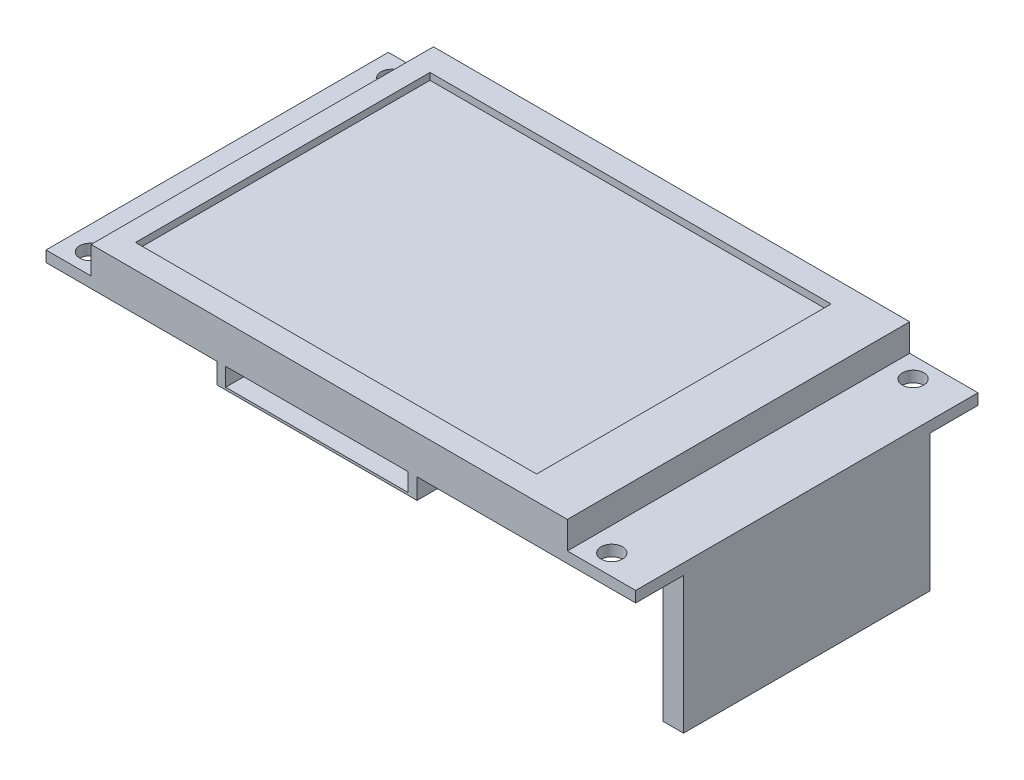
ISO-10303-21;
HEADER;
FILE_DESCRIPTION(('STEP AP214'),'2;1');
FILE_NAME('part.step','',(''),(''),'','','');
FILE_SCHEMA(('AUTOMOTIVE_DESIGN { 1 0 10303 214 1 1 1 1 }'));
ENDSEC;
DATA;
#1=APPLICATION_CONTEXT('core data for automotive mechanical design processes');
#2=APPLICATION_PROTOCOL_DEFINITION('international standard','automotive_design',2000,#1);
#3=PRODUCT_CONTEXT('',#1,'mechanical');
#4=PRODUCT('Part','Part','',(#3));
#5=PRODUCT_RELATED_PRODUCT_CATEGORY('part','',(#4));
#6=PRODUCT_DEFINITION_FORMATION('','',#4);
#7=PRODUCT_DEFINITION_CONTEXT('part definition',#1,'design');
#8=PRODUCT_DEFINITION('design','',#6,#7);
#9=PRODUCT_DEFINITION_SHAPE('','',#8);
#10=(LENGTH_UNIT() NAMED_UNIT(*) SI_UNIT(.MILLI.,.METRE.));
#11=(NAMED_UNIT(*) PLANE_ANGLE_UNIT() SI_UNIT($,.RADIAN.));
#12=(NAMED_UNIT(*) SI_UNIT($,.STERADIAN.) SOLID_ANGLE_UNIT());
#13=UNCERTAINTY_MEASURE_WITH_UNIT(LENGTH_MEASURE(1.E-05),#10,'distance_accuracy_value','');
#14=(GEOMETRIC_REPRESENTATION_CONTEXT(3) GLOBAL_UNCERTAINTY_ASSIGNED_CONTEXT((#13)) GLOBAL_UNIT_ASSIGNED_CONTEXT((#10,
#11,#12)) REPRESENTATION_CONTEXT('',''));
#15=CARTESIAN_POINT('',(0.,0.,0.));
#16=DIRECTION('',(0.,0.,1.));
#17=DIRECTION('',(1.,0.,0.));
#18=AXIS2_PLACEMENT_3D('',#15,#16,#17);
#19=CARTESIAN_POINT('',(0.,0.,0.));
#20=DIRECTION('',(0.,-1.,0.));
#21=DIRECTION('',(0.,0.,-1.));
#22=AXIS2_PLACEMENT_3D('',#19,#20,#21);
#23=PLANE('',#22);
#24=CARTESIAN_POINT('',(-39.65,0.,22.05));
#25=DIRECTION('',(0.,1.,0.));
#26=DIRECTION('',(0.,0.,1.));
#27=AXIS2_PLACEMENT_3D('',#24,#25,#26);
#28=CIRCLE('',#27,1.57);
#29=CARTESIAN_POINT('',(-39.65,0.,23.62));
#30=VERTEX_POINT('',#29);
#31=EDGE_CURVE('E346',#30,#30,#28,.T.);
#32=ORIENTED_EDGE('',*,*,#31,.T.);
#33=EDGE_LOOP('',(#32));
#34=FACE_BOUND('',#33,.T.);
#35=CARTESIAN_POINT('',(36.65,0.,-22.05));
#36=DIRECTION('',(0.,1.,0.));
#37=DIRECTION('',(0.,0.,1.));
#38=AXIS2_PLACEMENT_3D('',#35,#36,#37);
#39=CIRCLE('',#38,1.56999999999999);
#40=CARTESIAN_POINT('',(36.65,0.,-20.48));
#41=VERTEX_POINT('',#40);
#42=EDGE_CURVE('E353',#41,#41,#39,.T.);
#43=ORIENTED_EDGE('',*,*,#42,.T.);
#44=EDGE_LOOP('',(#43));
#45=FACE_BOUND('',#44,.T.);
#46=CARTESIAN_POINT('',(36.65,0.,22.05));
#47=DIRECTION('',(0.,1.,0.));
#48=DIRECTION('',(0.,0.,1.));
#49=AXIS2_PLACEMENT_3D('',#46,#47,#48);
#50=CIRCLE('',#49,1.56999999999999);
#51=CARTESIAN_POINT('',(36.65,0.,23.62));
#52=VERTEX_POINT('',#51);
#53=EDGE_CURVE('E359',#52,#52,#50,.T.);
#54=ORIENTED_EDGE('',*,*,#53,.T.);
#55=EDGE_LOOP('',(#54));
#56=FACE_BOUND('',#55,.T.);
#57=CARTESIAN_POINT('',(-39.65,0.,-22.05));
#58=DIRECTION('',(0.,1.,0.));
#59=DIRECTION('',(0.,0.,1.));
#60=AXIS2_PLACEMENT_3D('',#57,#58,#59);
#61=CIRCLE('',#60,1.57);
#62=CARTESIAN_POINT('',(-39.65,0.,-20.48));
#63=VERTEX_POINT('',#62);
#64=EDGE_CURVE('E364',#63,#63,#61,.T.);
#65=ORIENTED_EDGE('',*,*,#64,.T.);
#66=EDGE_LOOP('',(#65));
#67=FACE_BOUND('',#66,.T.);
#68=DIRECTION('',(1.,0.,0.));
#69=VECTOR('',#68,1.);
#70=CARTESIAN_POINT('',(-18.15,0.,5.04999999999999));
#71=LINE('',#70,#69);
#72=CARTESIAN_POINT('',(-18.15,0.,5.04999999999999));
#73=VERTEX_POINT('',#72);
#74=CARTESIAN_POINT('',(11.15,0.,5.04999999999999));
#75=VERTEX_POINT('',#74);
#76=EDGE_CURVE('E276',#73,#75,#71,.T.);
#77=ORIENTED_EDGE('',*,*,#76,.F.);
#78=DIRECTION('',(0.,0.,-1.));
#79=VECTOR('',#78,1.);
#80=CARTESIAN_POINT('',(-18.15,0.,25.05));
#81=LINE('',#80,#79);
#82=CARTESIAN_POINT('',(-18.15,0.,25.05));
#83=VERTEX_POINT('',#82);
#84=EDGE_CURVE('E257',#83,#73,#81,.T.);
#85=ORIENTED_EDGE('',*,*,#84,.F.);
#86=DIRECTION('',(1.,0.,0.));
#87=VECTOR('',#86,1.);
#88=CARTESIAN_POINT('',(-43.15,0.,25.05));
#89=LINE('',#88,#87);
#90=CARTESIAN_POINT('',(-43.15,0.,25.05));
#91=VERTEX_POINT('',#90);
#92=EDGE_CURVE('E374',#91,#83,#89,.T.);
#93=ORIENTED_EDGE('',*,*,#92,.F.);
#94=DIRECTION('',(0.,0.,1.));
#95=VECTOR('',#94,1.);
#96=CARTESIAN_POINT('',(-43.15,0.,25.05));
#97=LINE('',#96,#95);
#98=CARTESIAN_POINT('',(-43.15,0.,-25.05));
#99=VERTEX_POINT('',#98);
#100=EDGE_CURVE('E388',#99,#91,#97,.T.);
#101=ORIENTED_EDGE('',*,*,#100,.F.);
#102=DIRECTION('',(-1.,0.,0.));
#103=VECTOR('',#102,1.);
#104=CARTESIAN_POINT('',(-43.15,0.,-25.05));
#105=LINE('',#104,#103);
#106=CARTESIAN_POINT('',(43.15,0.,-25.05));
#107=VERTEX_POINT('',#106);
#108=EDGE_CURVE('E386',#107,#99,#105,.T.);
#109=ORIENTED_EDGE('',*,*,#108,.F.);
#110=DIRECTION('',(0.,0.,-1.));
#111=VECTOR('',#110,1.);
#112=CARTESIAN_POINT('',(43.15,0.,25.05));
#113=LINE('',#112,#111);
#114=CARTESIAN_POINT('',(43.15,0.,-18.05));
#115=VERTEX_POINT('',#114);
#116=EDGE_CURVE('E367',#115,#107,#113,.T.);
#117=ORIENTED_EDGE('',*,*,#116,.F.);
#118=DIRECTION('',(1.,0.,0.));
#119=VECTOR('',#118,1.);
#120=CARTESIAN_POINT('',(40.15,0.,-18.05));
#121=LINE('',#120,#119);
#122=CARTESIAN_POINT('',(40.15,0.,-18.05));
#123=VERTEX_POINT('',#122);
#124=EDGE_CURVE('E302',#123,#115,#121,.T.);
#125=ORIENTED_EDGE('',*,*,#124,.F.);
#126=DIRECTION('',(0.,0.,-1.));
#127=VECTOR('',#126,1.);
#128=CARTESIAN_POINT('',(40.15,0.,18.05));
#129=LINE('',#128,#127);
#130=CARTESIAN_POINT('',(40.15,0.,18.05));
#131=VERTEX_POINT('',#130);
#132=EDGE_CURVE('E288',#131,#123,#129,.T.);
#133=ORIENTED_EDGE('',*,*,#132,.F.);
#134=DIRECTION('',(-1.,0.,0.));
#135=VECTOR('',#134,1.);
#136=CARTESIAN_POINT('',(40.15,0.,18.05));
#137=LINE('',#136,#135);
#138=CARTESIAN_POINT('',(43.15,0.,18.05));
#139=VERTEX_POINT('',#138);
#140=EDGE_CURVE('E293',#139,#131,#137,.T.);
#141=ORIENTED_EDGE('',*,*,#140,.F.);
#142=CARTESIAN_POINT('',(43.15,0.,25.05));
#143=VERTEX_POINT('',#142);
#144=EDGE_CURVE('E383',#143,#139,#113,.T.);
#145=ORIENTED_EDGE('',*,*,#144,.F.);
#146=CARTESIAN_POINT('',(11.15,0.,25.05));
#147=VERTEX_POINT('',#146);
#148=EDGE_CURVE('E390',#147,#143,#89,.T.);
#149=ORIENTED_EDGE('',*,*,#148,.F.);
#150=DIRECTION('',(0.,0.,1.));
#151=VECTOR('',#150,1.);
#152=CARTESIAN_POINT('',(11.15,0.,25.05));
#153=LINE('',#152,#151);
#154=EDGE_CURVE('E267',#75,#147,#153,.T.);
#155=ORIENTED_EDGE('',*,*,#154,.F.);
#156=EDGE_LOOP('',(#77,#85,#93,#101,#109,#117,#125,#133,#141,#145,#149,#155));
#157=FACE_BOUND('',#156,.T.);
#158=ADVANCED_FACE('F33',(#34,#45,#56,#67,#157),#23,.T.);
#159=CARTESIAN_POINT('',(0.,1.6,0.));
#160=DIRECTION('',(0.,-1.,0.));
#161=DIRECTION('',(0.,0.,-1.));
#162=AXIS2_PLACEMENT_3D('',#159,#160,#161);
#163=PLANE('',#162);
#164=CARTESIAN_POINT('',(-39.65,1.6,-22.05));
#165=DIRECTION('',(0.,1.,0.));
#166=DIRECTION('',(0.,0.,1.));
#167=AXIS2_PLACEMENT_3D('',#164,#165,#166);
#168=CIRCLE('',#167,1.57);
#169=CARTESIAN_POINT('',(-39.65,1.6,-20.48));
#170=VERTEX_POINT('',#169);
#171=EDGE_CURVE('E349',#170,#170,#168,.T.);
#172=ORIENTED_EDGE('',*,*,#171,.F.);
#173=EDGE_LOOP('',(#172));
#174=FACE_BOUND('',#173,.T.);
#175=CARTESIAN_POINT('',(-39.65,1.6,22.05));
#176=DIRECTION('',(0.,1.,0.));
#177=DIRECTION('',(0.,0.,1.));
#178=AXIS2_PLACEMENT_3D('',#175,#176,#177);
#179=CIRCLE('',#178,1.57);
#180=CARTESIAN_POINT('',(-39.65,1.6,23.62));
#181=VERTEX_POINT('',#180);
#182=EDGE_CURVE('E350',#181,#181,#179,.T.);
#183=ORIENTED_EDGE('',*,*,#182,.F.);
#184=EDGE_LOOP('',(#183));
#185=FACE_BOUND('',#184,.T.);
#186=DIRECTION('',(0.,0.,1.));
#187=VECTOR('',#186,1.);
#188=CARTESIAN_POINT('',(-36.55,1.6,-25.05));
#189=LINE('',#188,#187);
#190=CARTESIAN_POINT('',(-36.55,1.6,-25.05));
#191=VERTEX_POINT('',#190);
#192=CARTESIAN_POINT('',(-36.55,1.6,25.05));
#193=VERTEX_POINT('',#192);
#194=EDGE_CURVE('E318',#191,#193,#189,.T.);
#195=ORIENTED_EDGE('',*,*,#194,.F.);
#196=DIRECTION('',(-1.,0.,0.));
#197=VECTOR('',#196,1.);
#198=CARTESIAN_POINT('',(-43.15,1.6,-25.05));
#199=LINE('',#198,#197);
#200=CARTESIAN_POINT('',(-43.15,1.6,-25.05));
#201=VERTEX_POINT('',#200);
#202=EDGE_CURVE('E373',#191,#201,#199,.T.);
#203=ORIENTED_EDGE('',*,*,#202,.T.);
#204=DIRECTION('',(0.,0.,1.));
#205=VECTOR('',#204,1.);
#206=CARTESIAN_POINT('',(-43.15,1.6,25.05));
#207=LINE('',#206,#205);
#208=CARTESIAN_POINT('',(-43.15,1.6,25.05));
#209=VERTEX_POINT('',#208);
#210=EDGE_CURVE('E377',#201,#209,#207,.T.);
#211=ORIENTED_EDGE('',*,*,#210,.T.);
#212=DIRECTION('',(1.,0.,0.));
#213=VECTOR('',#212,1.);
#214=CARTESIAN_POINT('',(-43.15,1.6,25.05));
#215=LINE('',#214,#213);
#216=EDGE_CURVE('E380',#209,#193,#215,.T.);
#217=ORIENTED_EDGE('',*,*,#216,.T.);
#218=EDGE_LOOP('',(#195,#203,#211,#217));
#219=FACE_BOUND('',#218,.T.);
#220=ADVANCED_FACE('F419',(#174,#185,#219),#163,.F.);
#221=CARTESIAN_POINT('',(36.65,1.6,22.05));
#222=DIRECTION('',(0.,1.,0.));
#223=DIRECTION('',(0.,0.,1.));
#224=AXIS2_PLACEMENT_3D('',#221,#222,#223);
#225=CIRCLE('',#224,1.56999999999999);
#226=CARTESIAN_POINT('',(36.65,1.6,23.62));
#227=VERTEX_POINT('',#226);
#228=EDGE_CURVE('E345',#227,#227,#225,.T.);
#229=ORIENTED_EDGE('',*,*,#228,.F.);
#230=EDGE_LOOP('',(#229));
#231=FACE_BOUND('',#230,.T.);
#232=CARTESIAN_POINT('',(36.65,1.6,-22.05));
#233=DIRECTION('',(0.,1.,0.));
#234=DIRECTION('',(0.,0.,1.));
#235=AXIS2_PLACEMENT_3D('',#232,#233,#234);
#236=CIRCLE('',#235,1.56999999999999);
#237=CARTESIAN_POINT('',(36.65,1.6,-20.48));
#238=VERTEX_POINT('',#237);
#239=EDGE_CURVE('E356',#238,#238,#236,.T.);
#240=ORIENTED_EDGE('',*,*,#239,.F.);
#241=EDGE_LOOP('',(#240));
#242=FACE_BOUND('',#241,.T.);
#243=DIRECTION('',(0.,0.,-1.));
#244=VECTOR('',#243,1.);
#245=CARTESIAN_POINT('',(33.15,1.6,-25.05));
#246=LINE('',#245,#244);
#247=CARTESIAN_POINT('',(33.15,1.6,25.05));
#248=VERTEX_POINT('',#247);
#249=CARTESIAN_POINT('',(33.15,1.6,-25.05));
#250=VERTEX_POINT('',#249);
#251=EDGE_CURVE('E323',#248,#250,#246,.T.);
#252=ORIENTED_EDGE('',*,*,#251,.F.);
#253=CARTESIAN_POINT('',(43.15,1.6,25.05));
#254=VERTEX_POINT('',#253);
#255=EDGE_CURVE('E379',#248,#254,#215,.T.);
#256=ORIENTED_EDGE('',*,*,#255,.T.);
#257=DIRECTION('',(0.,0.,-1.));
#258=VECTOR('',#257,1.);
#259=CARTESIAN_POINT('',(43.15,1.6,25.05));
#260=LINE('',#259,#258);
#261=CARTESIAN_POINT('',(43.15,1.6,-25.05));
#262=VERTEX_POINT('',#261);
#263=EDGE_CURVE('E370',#254,#262,#260,.T.);
#264=ORIENTED_EDGE('',*,*,#263,.T.);
#265=EDGE_CURVE('E375',#262,#250,#199,.T.);
#266=ORIENTED_EDGE('',*,*,#265,.T.);
#267=EDGE_LOOP('',(#252,#256,#264,#266));
#268=FACE_BOUND('',#267,.T.);
#269=ADVANCED_FACE('F435',(#231,#242,#268),#163,.F.);
#270=CARTESIAN_POINT('',(43.15,1.6,25.05));
#271=DIRECTION('',(-1.,0.,0.));
#272=DIRECTION('',(0.,0.,1.));
#273=AXIS2_PLACEMENT_3D('',#270,#271,#272);
#274=PLANE('',#273);
#275=ORIENTED_EDGE('',*,*,#144,.T.);
#276=DIRECTION('',(0.,1.,0.));
#277=VECTOR('',#276,1.);
#278=CARTESIAN_POINT('',(43.15,-20.,18.05));
#279=LINE('',#278,#277);
#280=CARTESIAN_POINT('',(43.15,-20.,18.05));
#281=VERTEX_POINT('',#280);
#282=EDGE_CURVE('E309',#281,#139,#279,.T.);
#283=ORIENTED_EDGE('',*,*,#282,.F.);
#284=DIRECTION('',(0.,0.,1.));
#285=VECTOR('',#284,1.);
#286=CARTESIAN_POINT('',(43.15,-20.,18.05));
#287=LINE('',#286,#285);
#288=CARTESIAN_POINT('',(43.15,-20.,-18.05));
#289=VERTEX_POINT('',#288);
#290=EDGE_CURVE('E295',#289,#281,#287,.T.);
#291=ORIENTED_EDGE('',*,*,#290,.F.);
#292=DIRECTION('',(0.,1.,0.));
#293=VECTOR('',#292,1.);
#294=CARTESIAN_POINT('',(43.15,-20.,-18.05));
#295=LINE('',#294,#293);
#296=EDGE_CURVE('E312',#289,#115,#295,.T.);
#297=ORIENTED_EDGE('',*,*,#296,.T.);
#298=ORIENTED_EDGE('',*,*,#116,.T.);
#299=DIRECTION('',(0.,-1.,0.));
#300=VECTOR('',#299,1.);
#301=CARTESIAN_POINT('',(43.15,1.6,-25.05));
#302=LINE('',#301,#300);
#303=EDGE_CURVE('E11',#262,#107,#302,.T.);
#304=ORIENTED_EDGE('',*,*,#303,.F.);
#305=ORIENTED_EDGE('',*,*,#263,.F.);
#306=DIRECTION('',(0.,-1.,0.));
#307=VECTOR('',#306,1.);
#308=CARTESIAN_POINT('',(43.15,1.6,25.05));
#309=LINE('',#308,#307);
#310=EDGE_CURVE('E382',#254,#143,#309,.T.);
#311=ORIENTED_EDGE('',*,*,#310,.T.);
#312=EDGE_LOOP('',(#275,#283,#291,#297,#298,#304,#305,#311));
#313=FACE_BOUND('',#312,.T.);
#314=ADVANCED_FACE('F35',(#313),#274,.F.);
#315=CARTESIAN_POINT('',(-43.15,1.6,-25.05));
#316=DIRECTION('',(0.,0.,1.));
#317=DIRECTION('',(1.,0.,0.));
#318=AXIS2_PLACEMENT_3D('',#315,#316,#317);
#319=PLANE('',#318);
#320=ORIENTED_EDGE('',*,*,#108,.T.);
#321=DIRECTION('',(0.,-1.,0.));
#322=VECTOR('',#321,1.);
#323=CARTESIAN_POINT('',(-43.15,1.6,-25.05));
#324=LINE('',#323,#322);
#325=EDGE_CURVE('E41',#201,#99,#324,.T.);
#326=ORIENTED_EDGE('',*,*,#325,.F.);
#327=ORIENTED_EDGE('',*,*,#202,.F.);
#328=DIRECTION('',(0.,-1.,0.));
#329=VECTOR('',#328,1.);
#330=CARTESIAN_POINT('',(-36.55,5.6,-25.05));
#331=LINE('',#330,#329);
#332=CARTESIAN_POINT('',(-36.55,5.6,-25.05));
#333=VERTEX_POINT('',#332);
#334=EDGE_CURVE('E329',#333,#191,#331,.T.);
#335=ORIENTED_EDGE('',*,*,#334,.F.);
#336=DIRECTION('',(-1.,0.,0.));
#337=VECTOR('',#336,1.);
#338=CARTESIAN_POINT('',(-36.55,5.6,-25.05));
#339=LINE('',#338,#337);
#340=CARTESIAN_POINT('',(33.15,5.6,-25.05));
#341=VERTEX_POINT('',#340);
#342=EDGE_CURVE('E327',#341,#333,#339,.T.);
#343=ORIENTED_EDGE('',*,*,#342,.F.);
#344=DIRECTION('',(0.,-1.,0.));
#345=VECTOR('',#344,1.);
#346=CARTESIAN_POINT('',(33.15,5.6,-25.05));
#347=LINE('',#346,#345);
#348=EDGE_CURVE('E336',#341,#250,#347,.T.);
#349=ORIENTED_EDGE('',*,*,#348,.T.);
#350=ORIENTED_EDGE('',*,*,#265,.F.);
#351=ORIENTED_EDGE('',*,*,#303,.T.);
#352=EDGE_LOOP('',(#320,#326,#327,#335,#343,#349,#350,#351));
#353=FACE_BOUND('',#352,.T.);
#354=ADVANCED_FACE('F421',(#353),#319,.F.);
#355=CARTESIAN_POINT('',(-43.15,1.6,25.05));
#356=DIRECTION('',(1.,0.,0.));
#357=DIRECTION('',(0.,0.,-1.));
#358=AXIS2_PLACEMENT_3D('',#355,#356,#357);
#359=PLANE('',#358);
#360=ORIENTED_EDGE('',*,*,#100,.T.);
#361=DIRECTION('',(0.,-1.,0.));
#362=VECTOR('',#361,1.);
#363=CARTESIAN_POINT('',(-43.15,1.6,25.05));
#364=LINE('',#363,#362);
#365=EDGE_CURVE('E395',#209,#91,#364,.T.);
#366=ORIENTED_EDGE('',*,*,#365,.F.);
#367=ORIENTED_EDGE('',*,*,#210,.F.);
#368=ORIENTED_EDGE('',*,*,#325,.T.);
#369=EDGE_LOOP('',(#360,#366,#367,#368));
#370=FACE_BOUND('',#369,.T.);
#371=ADVANCED_FACE('F402',(#370),#359,.F.);
#372=CARTESIAN_POINT('',(-43.15,1.6,25.05));
#373=DIRECTION('',(0.,0.,-1.));
#374=DIRECTION('',(-1.,0.,0.));
#375=AXIS2_PLACEMENT_3D('',#372,#373,#374);
#376=PLANE('',#375);
#377=DIRECTION('',(1.,0.,0.));
#378=VECTOR('',#377,1.);
#379=CARTESIAN_POINT('',(-16.85,-2.65,25.05));
#380=LINE('',#379,#378);
#381=CARTESIAN_POINT('',(-16.85,-2.65,25.05));
#382=VERTEX_POINT('',#381);
#383=CARTESIAN_POINT('',(9.84999999999999,-2.65,25.05));
#384=VERTEX_POINT('',#383);
#385=EDGE_CURVE('E247',#382,#384,#380,.T.);
#386=ORIENTED_EDGE('',*,*,#385,.F.);
#387=DIRECTION('',(0.,-1.,0.));
#388=VECTOR('',#387,1.);
#389=CARTESIAN_POINT('',(-16.85,0.,25.05));
#390=LINE('',#389,#388);
#391=CARTESIAN_POINT('',(-16.85,0.,25.05));
#392=VERTEX_POINT('',#391);
#393=EDGE_CURVE('E56',#392,#382,#390,.T.);
#394=ORIENTED_EDGE('',*,*,#393,.F.);
#395=DIRECTION('',(-1.,0.,0.));
#396=VECTOR('',#395,1.);
#397=CARTESIAN_POINT('',(-16.85,0.,25.05));
#398=LINE('',#397,#396);
#399=CARTESIAN_POINT('',(9.84999999999999,0.,25.05));
#400=VERTEX_POINT('',#399);
#401=EDGE_CURVE('E236',#400,#392,#398,.T.);
#402=ORIENTED_EDGE('',*,*,#401,.F.);
#403=DIRECTION('',(0.,1.,0.));
#404=VECTOR('',#403,1.);
#405=CARTESIAN_POINT('',(9.84999999999999,0.,25.05));
#406=LINE('',#405,#404);
#407=EDGE_CURVE('E250',#384,#400,#406,.T.);
#408=ORIENTED_EDGE('',*,*,#407,.F.);
#409=EDGE_LOOP('',(#386,#394,#402,#408));
#410=FACE_BOUND('',#409,.T.);
#411=ORIENTED_EDGE('',*,*,#92,.T.);
#412=DIRECTION('',(0.,1.,0.));
#413=VECTOR('',#412,1.);
#414=CARTESIAN_POINT('',(-18.15,-3.,25.05));
#415=LINE('',#414,#413);
#416=CARTESIAN_POINT('',(-18.15,-3.,25.05));
#417=VERTEX_POINT('',#416);
#418=EDGE_CURVE('E273',#417,#83,#415,.T.);
#419=ORIENTED_EDGE('',*,*,#418,.F.);
#420=DIRECTION('',(-1.,0.,0.));
#421=VECTOR('',#420,1.);
#422=CARTESIAN_POINT('',(-18.15,-3.,25.05));
#423=LINE('',#422,#421);
#424=CARTESIAN_POINT('',(11.15,-3.,25.05));
#425=VERTEX_POINT('',#424);
#426=EDGE_CURVE('E271',#425,#417,#423,.T.);
#427=ORIENTED_EDGE('',*,*,#426,.F.);
#428=DIRECTION('',(0.,1.,0.));
#429=VECTOR('',#428,1.);
#430=CARTESIAN_POINT('',(11.15,-3.,25.05));
#431=LINE('',#430,#429);
#432=EDGE_CURVE('E281',#425,#147,#431,.T.);
#433=ORIENTED_EDGE('',*,*,#432,.T.);
#434=ORIENTED_EDGE('',*,*,#148,.T.);
#435=ORIENTED_EDGE('',*,*,#310,.F.);
#436=ORIENTED_EDGE('',*,*,#255,.F.);
#437=DIRECTION('',(0.,-1.,0.));
#438=VECTOR('',#437,1.);
#439=CARTESIAN_POINT('',(33.15,5.6,25.05));
#440=LINE('',#439,#438);
#441=CARTESIAN_POINT('',(33.15,5.6,25.05));
#442=VERTEX_POINT('',#441);
#443=EDGE_CURVE('E339',#442,#248,#440,.T.);
#444=ORIENTED_EDGE('',*,*,#443,.F.);
#445=DIRECTION('',(1.,0.,0.));
#446=VECTOR('',#445,1.);
#447=CARTESIAN_POINT('',(-36.55,5.6,25.05));
#448=LINE('',#447,#446);
#449=CARTESIAN_POINT('',(-36.55,5.6,25.05));
#450=VERTEX_POINT('',#449);
#451=EDGE_CURVE('E322',#450,#442,#448,.T.);
#452=ORIENTED_EDGE('',*,*,#451,.F.);
#453=DIRECTION('',(0.,-1.,0.));
#454=VECTOR('',#453,1.);
#455=CARTESIAN_POINT('',(-36.55,5.6,25.05));
#456=LINE('',#455,#454);
#457=EDGE_CURVE('E342',#450,#193,#456,.T.);
#458=ORIENTED_EDGE('',*,*,#457,.T.);
#459=ORIENTED_EDGE('',*,*,#216,.F.);
#460=ORIENTED_EDGE('',*,*,#365,.T.);
#461=EDGE_LOOP('',(#411,#419,#427,#433,#434,#435,#436,#444,#452,#458,#459,#460));
#462=FACE_BOUND('',#461,.T.);
#463=ADVANCED_FACE('F413',(#410,#462),#376,.F.);
#464=CARTESIAN_POINT('',(-39.65,0.,-22.05));
#465=DIRECTION('',(0.,1.,0.));
#466=DIRECTION('',(0.,0.,1.));
#467=AXIS2_PLACEMENT_3D('',#464,#465,#466);
#468=CYLINDRICAL_SURFACE('',#467,1.57);
#469=ORIENTED_EDGE('',*,*,#64,.F.);
#470=EDGE_LOOP('',(#469));
#471=FACE_BOUND('',#470,.T.);
#472=ORIENTED_EDGE('',*,*,#171,.T.);
#473=EDGE_LOOP('',(#472));
#474=FACE_BOUND('',#473,.T.);
#475=ADVANCED_FACE('F491',(#471,#474),#468,.F.);
#476=CARTESIAN_POINT('',(36.65,0.,22.05));
#477=DIRECTION('',(0.,1.,0.));
#478=DIRECTION('',(0.,0.,1.));
#479=AXIS2_PLACEMENT_3D('',#476,#477,#478);
#480=CYLINDRICAL_SURFACE('',#479,1.56999999999999);
#481=ORIENTED_EDGE('',*,*,#53,.F.);
#482=EDGE_LOOP('',(#481));
#483=FACE_BOUND('',#482,.T.);
#484=ORIENTED_EDGE('',*,*,#228,.T.);
#485=EDGE_LOOP('',(#484));
#486=FACE_BOUND('',#485,.T.);
#487=ADVANCED_FACE('F511',(#483,#486),#480,.F.);
#488=CARTESIAN_POINT('',(36.65,0.,-22.05));
#489=DIRECTION('',(0.,1.,0.));
#490=DIRECTION('',(0.,0.,1.));
#491=AXIS2_PLACEMENT_3D('',#488,#489,#490);
#492=CYLINDRICAL_SURFACE('',#491,1.56999999999999);
#493=ORIENTED_EDGE('',*,*,#42,.F.);
#494=EDGE_LOOP('',(#493));
#495=FACE_BOUND('',#494,.T.);
#496=ORIENTED_EDGE('',*,*,#239,.T.);
#497=EDGE_LOOP('',(#496));
#498=FACE_BOUND('',#497,.T.);
#499=ADVANCED_FACE('F508',(#495,#498),#492,.F.);
#500=CARTESIAN_POINT('',(-39.65,0.,22.05));
#501=DIRECTION('',(0.,1.,0.));
#502=DIRECTION('',(0.,0.,1.));
#503=AXIS2_PLACEMENT_3D('',#500,#501,#502);
#504=CYLINDRICAL_SURFACE('',#503,1.57);
#505=ORIENTED_EDGE('',*,*,#31,.F.);
#506=EDGE_LOOP('',(#505));
#507=FACE_BOUND('',#506,.T.);
#508=ORIENTED_EDGE('',*,*,#182,.T.);
#509=EDGE_LOOP('',(#508));
#510=FACE_BOUND('',#509,.T.);
#511=ADVANCED_FACE('F510',(#507,#510),#504,.F.);
#512=CARTESIAN_POINT('',(-36.55,5.6,-25.05));
#513=DIRECTION('',(1.,0.,0.));
#514=DIRECTION('',(0.,0.,-1.));
#515=AXIS2_PLACEMENT_3D('',#512,#513,#514);
#516=PLANE('',#515);
#517=ORIENTED_EDGE('',*,*,#194,.T.);
#518=ORIENTED_EDGE('',*,*,#457,.F.);
#519=DIRECTION('',(0.,0.,1.));
#520=VECTOR('',#519,1.);
#521=CARTESIAN_POINT('',(-36.55,5.6,-25.05));
#522=LINE('',#521,#520);
#523=EDGE_CURVE('E319',#333,#450,#522,.T.);
#524=ORIENTED_EDGE('',*,*,#523,.F.);
#525=ORIENTED_EDGE('',*,*,#334,.T.);
#526=EDGE_LOOP('',(#517,#518,#524,#525));
#527=FACE_BOUND('',#526,.T.);
#528=ADVANCED_FACE('F425',(#527),#516,.F.);
#529=CARTESIAN_POINT('',(33.15,5.6,-25.05));
#530=DIRECTION('',(-1.,0.,0.));
#531=DIRECTION('',(0.,0.,1.));
#532=AXIS2_PLACEMENT_3D('',#529,#530,#531);
#533=PLANE('',#532);
#534=ORIENTED_EDGE('',*,*,#251,.T.);
#535=ORIENTED_EDGE('',*,*,#348,.F.);
#536=DIRECTION('',(0.,0.,-1.));
#537=VECTOR('',#536,1.);
#538=CARTESIAN_POINT('',(33.15,5.6,-25.05));
#539=LINE('',#538,#537);
#540=EDGE_CURVE('E325',#442,#341,#539,.T.);
#541=ORIENTED_EDGE('',*,*,#540,.F.);
#542=ORIENTED_EDGE('',*,*,#443,.T.);
#543=EDGE_LOOP('',(#534,#535,#541,#542));
#544=FACE_BOUND('',#543,.T.);
#545=ADVANCED_FACE('F432',(#544),#533,.F.);
#546=CARTESIAN_POINT('',(0.,5.6,0.));
#547=DIRECTION('',(0.,1.,0.));
#548=DIRECTION('',(0.,0.,1.));
#549=AXIS2_PLACEMENT_3D('',#546,#547,#548);
#550=PLANE('',#549);
#551=DIRECTION('',(0.,0.,1.));
#552=VECTOR('',#551,1.);
#553=CARTESIAN_POINT('',(-33.55,5.6,-21.55));
#554=LINE('',#553,#552);
#555=CARTESIAN_POINT('',(-33.55,5.6,-21.55));
#556=VERTEX_POINT('',#555);
#557=CARTESIAN_POINT('',(-33.55,5.6,21.55));
#558=VERTEX_POINT('',#557);
#559=EDGE_CURVE('E48',#556,#558,#554,.T.);
#560=ORIENTED_EDGE('',*,*,#559,.F.);
#561=DIRECTION('',(-1.,0.,0.));
#562=VECTOR('',#561,1.);
#563=CARTESIAN_POINT('',(-33.55,5.6,-21.55));
#564=LINE('',#563,#562);
#565=CARTESIAN_POINT('',(25.15,5.6,-21.55));
#566=VERTEX_POINT('',#565);
#567=EDGE_CURVE('E214',#566,#556,#564,.T.);
#568=ORIENTED_EDGE('',*,*,#567,.F.);
#569=DIRECTION('',(0.,0.,-1.));
#570=VECTOR('',#569,1.);
#571=CARTESIAN_POINT('',(25.15,5.6,-21.55));
#572=LINE('',#571,#570);
#573=CARTESIAN_POINT('',(25.15,5.6,21.55));
#574=VERTEX_POINT('',#573);
#575=EDGE_CURVE('E217',#574,#566,#572,.T.);
#576=ORIENTED_EDGE('',*,*,#575,.F.);
#577=DIRECTION('',(1.,0.,0.));
#578=VECTOR('',#577,1.);
#579=CARTESIAN_POINT('',(-33.55,5.6,21.55));
#580=LINE('',#579,#578);
#581=EDGE_CURVE('E223',#558,#574,#580,.T.);
#582=ORIENTED_EDGE('',*,*,#581,.F.);
#583=EDGE_LOOP('',(#560,#568,#576,#582));
#584=FACE_BOUND('',#583,.T.);
#585=ORIENTED_EDGE('',*,*,#523,.T.);
#586=ORIENTED_EDGE('',*,*,#451,.T.);
#587=ORIENTED_EDGE('',*,*,#540,.T.);
#588=ORIENTED_EDGE('',*,*,#342,.T.);
#589=EDGE_LOOP('',(#585,#586,#587,#588));
#590=FACE_BOUND('',#589,.T.);
#591=ADVANCED_FACE('F427',(#584,#590),#550,.T.);
#592=CARTESIAN_POINT('',(40.15,-20.,18.05));
#593=DIRECTION('',(1.,0.,0.));
#594=DIRECTION('',(0.,0.,-1.));
#595=AXIS2_PLACEMENT_3D('',#592,#593,#594);
#596=PLANE('',#595);
#597=ORIENTED_EDGE('',*,*,#132,.T.);
#598=DIRECTION('',(0.,1.,0.));
#599=VECTOR('',#598,1.);
#600=CARTESIAN_POINT('',(40.15,-20.,-18.05));
#601=LINE('',#600,#599);
#602=CARTESIAN_POINT('',(40.15,-20.,-18.05));
#603=VERTEX_POINT('',#602);
#604=EDGE_CURVE('E315',#603,#123,#601,.T.);
#605=ORIENTED_EDGE('',*,*,#604,.F.);
#606=DIRECTION('',(0.,0.,-1.));
#607=VECTOR('',#606,1.);
#608=CARTESIAN_POINT('',(40.15,-20.,18.05));
#609=LINE('',#608,#607);
#610=CARTESIAN_POINT('',(40.15,-20.,18.05));
#611=VERTEX_POINT('',#610);
#612=EDGE_CURVE('E289',#611,#603,#609,.T.);
#613=ORIENTED_EDGE('',*,*,#612,.F.);
#614=DIRECTION('',(0.,1.,0.));
#615=VECTOR('',#614,1.);
#616=CARTESIAN_POINT('',(40.15,-20.,18.05));
#617=LINE('',#616,#615);
#618=EDGE_CURVE('E299',#611,#131,#617,.T.);
#619=ORIENTED_EDGE('',*,*,#618,.T.);
#620=EDGE_LOOP('',(#597,#605,#613,#619));
#621=FACE_BOUND('',#620,.T.);
#622=ADVANCED_FACE('F449',(#621),#596,.F.);
#623=CARTESIAN_POINT('',(40.15,-20.,-18.05));
#624=DIRECTION('',(0.,0.,1.));
#625=DIRECTION('',(1.,0.,0.));
#626=AXIS2_PLACEMENT_3D('',#623,#624,#625);
#627=PLANE('',#626);
#628=ORIENTED_EDGE('',*,*,#124,.T.);
#629=ORIENTED_EDGE('',*,*,#296,.F.);
#630=DIRECTION('',(1.,0.,0.));
#631=VECTOR('',#630,1.);
#632=CARTESIAN_POINT('',(40.15,-20.,-18.05));
#633=LINE('',#632,#631);
#634=EDGE_CURVE('E292',#603,#289,#633,.T.);
#635=ORIENTED_EDGE('',*,*,#634,.F.);
#636=ORIENTED_EDGE('',*,*,#604,.T.);
#637=EDGE_LOOP('',(#628,#629,#635,#636));
#638=FACE_BOUND('',#637,.T.);
#639=ADVANCED_FACE('F445',(#638),#627,.F.);
#640=CARTESIAN_POINT('',(40.15,-20.,18.05));
#641=DIRECTION('',(0.,0.,-1.));
#642=DIRECTION('',(-1.,0.,0.));
#643=AXIS2_PLACEMENT_3D('',#640,#641,#642);
#644=PLANE('',#643);
#645=ORIENTED_EDGE('',*,*,#140,.T.);
#646=ORIENTED_EDGE('',*,*,#618,.F.);
#647=DIRECTION('',(-1.,0.,0.));
#648=VECTOR('',#647,1.);
#649=CARTESIAN_POINT('',(40.15,-20.,18.05));
#650=LINE('',#649,#648);
#651=EDGE_CURVE('E297',#281,#611,#650,.T.);
#652=ORIENTED_EDGE('',*,*,#651,.F.);
#653=ORIENTED_EDGE('',*,*,#282,.T.);
#654=EDGE_LOOP('',(#645,#646,#652,#653));
#655=FACE_BOUND('',#654,.T.);
#656=ADVANCED_FACE('F452',(#655),#644,.F.);
#657=CARTESIAN_POINT('',(0.,-20.,0.));
#658=DIRECTION('',(0.,-1.,0.));
#659=DIRECTION('',(0.,0.,-1.));
#660=AXIS2_PLACEMENT_3D('',#657,#658,#659);
#661=PLANE('',#660);
#662=ORIENTED_EDGE('',*,*,#612,.T.);
#663=ORIENTED_EDGE('',*,*,#634,.T.);
#664=ORIENTED_EDGE('',*,*,#290,.T.);
#665=ORIENTED_EDGE('',*,*,#651,.T.);
#666=EDGE_LOOP('',(#662,#663,#664,#665));
#667=FACE_BOUND('',#666,.T.);
#668=ADVANCED_FACE('F615',(#667),#661,.T.);
#669=CARTESIAN_POINT('',(-18.15,-3.,25.05));
#670=DIRECTION('',(1.,0.,0.));
#671=DIRECTION('',(0.,0.,-1.));
#672=AXIS2_PLACEMENT_3D('',#669,#670,#671);
#673=PLANE('',#672);
#674=ORIENTED_EDGE('',*,*,#84,.T.);
#675=DIRECTION('',(0.,1.,0.));
#676=VECTOR('',#675,1.);
#677=CARTESIAN_POINT('',(-18.15,-3.,5.04999999999999));
#678=LINE('',#677,#676);
#679=CARTESIAN_POINT('',(-18.15,-3.,5.04999999999999));
#680=VERTEX_POINT('',#679);
#681=EDGE_CURVE('E286',#680,#73,#678,.T.);
#682=ORIENTED_EDGE('',*,*,#681,.F.);
#683=DIRECTION('',(0.,0.,-1.));
#684=VECTOR('',#683,1.);
#685=CARTESIAN_POINT('',(-18.15,-3.,25.05));
#686=LINE('',#685,#684);
#687=EDGE_CURVE('E263',#417,#680,#686,.T.);
#688=ORIENTED_EDGE('',*,*,#687,.F.);
#689=ORIENTED_EDGE('',*,*,#418,.T.);
#690=EDGE_LOOP('',(#674,#682,#688,#689));
#691=FACE_BOUND('',#690,.T.);
#692=ADVANCED_FACE('F465',(#691),#673,.F.);
#693=CARTESIAN_POINT('',(-18.15,-3.,5.04999999999999));
#694=DIRECTION('',(0.,0.,1.));
#695=DIRECTION('',(1.,0.,0.));
#696=AXIS2_PLACEMENT_3D('',#693,#694,#695);
#697=PLANE('',#696);
#698=ORIENTED_EDGE('',*,*,#76,.T.);
#699=DIRECTION('',(0.,1.,0.));
#700=VECTOR('',#699,1.);
#701=CARTESIAN_POINT('',(11.15,-3.,5.04999999999999));
#702=LINE('',#701,#700);
#703=CARTESIAN_POINT('',(11.15,-3.,5.04999999999999));
#704=VERTEX_POINT('',#703);
#705=EDGE_CURVE('E283',#704,#75,#702,.T.);
#706=ORIENTED_EDGE('',*,*,#705,.F.);
#707=DIRECTION('',(1.,0.,0.));
#708=VECTOR('',#707,1.);
#709=CARTESIAN_POINT('',(-18.15,-3.,5.04999999999999));
#710=LINE('',#709,#708);
#711=EDGE_CURVE('E266',#680,#704,#710,.T.);
#712=ORIENTED_EDGE('',*,*,#711,.F.);
#713=ORIENTED_EDGE('',*,*,#681,.T.);
#714=EDGE_LOOP('',(#698,#706,#712,#713));
#715=FACE_BOUND('',#714,.T.);
#716=ADVANCED_FACE('F462',(#715),#697,.F.);
#717=CARTESIAN_POINT('',(11.15,-3.,25.05));
#718=DIRECTION('',(-1.,0.,0.));
#719=DIRECTION('',(0.,0.,1.));
#720=AXIS2_PLACEMENT_3D('',#717,#718,#719);
#721=PLANE('',#720);
#722=ORIENTED_EDGE('',*,*,#154,.T.);
#723=ORIENTED_EDGE('',*,*,#432,.F.);
#724=DIRECTION('',(0.,0.,1.));
#725=VECTOR('',#724,1.);
#726=CARTESIAN_POINT('',(11.15,-3.,25.05));
#727=LINE('',#726,#725);
#728=EDGE_CURVE('E269',#704,#425,#727,.T.);
#729=ORIENTED_EDGE('',*,*,#728,.F.);
#730=ORIENTED_EDGE('',*,*,#705,.T.);
#731=EDGE_LOOP('',(#722,#723,#729,#730));
#732=FACE_BOUND('',#731,.T.);
#733=ADVANCED_FACE('F458',(#732),#721,.F.);
#734=CARTESIAN_POINT('',(0.,-3.,0.));
#735=DIRECTION('',(0.,-1.,0.));
#736=DIRECTION('',(0.,0.,-1.));
#737=AXIS2_PLACEMENT_3D('',#734,#735,#736);
#738=PLANE('',#737);
#739=ORIENTED_EDGE('',*,*,#687,.T.);
#740=ORIENTED_EDGE('',*,*,#711,.T.);
#741=ORIENTED_EDGE('',*,*,#728,.T.);
#742=ORIENTED_EDGE('',*,*,#426,.T.);
#743=EDGE_LOOP('',(#739,#740,#741,#742));
#744=FACE_BOUND('',#743,.T.);
#745=ADVANCED_FACE('F467',(#744),#738,.T.);
#746=CARTESIAN_POINT('',(-16.85,0.,20.05));
#747=DIRECTION('',(-1.,0.,0.));
#748=DIRECTION('',(0.,0.,1.));
#749=AXIS2_PLACEMENT_3D('',#746,#747,#748);
#750=PLANE('',#749);
#751=ORIENTED_EDGE('',*,*,#393,.T.);
#752=DIRECTION('',(0.,0.,1.));
#753=VECTOR('',#752,1.);
#754=CARTESIAN_POINT('',(-16.85,-2.65,20.05));
#755=LINE('',#754,#753);
#756=CARTESIAN_POINT('',(-16.85,-2.65,20.05));
#757=VERTEX_POINT('',#756);
#758=EDGE_CURVE('E245',#757,#382,#755,.T.);
#759=ORIENTED_EDGE('',*,*,#758,.F.);
#760=DIRECTION('',(0.,-1.,0.));
#761=VECTOR('',#760,1.);
#762=CARTESIAN_POINT('',(-16.85,0.,20.05));
#763=LINE('',#762,#761);
#764=CARTESIAN_POINT('',(-16.85,0.,20.05));
#765=VERTEX_POINT('',#764);
#766=EDGE_CURVE('E232',#765,#757,#763,.T.);
#767=ORIENTED_EDGE('',*,*,#766,.F.);
#768=DIRECTION('',(0.,0.,1.));
#769=VECTOR('',#768,1.);
#770=CARTESIAN_POINT('',(-16.85,0.,20.05));
#771=LINE('',#770,#769);
#772=EDGE_CURVE('E255',#765,#392,#771,.T.);
#773=ORIENTED_EDGE('',*,*,#772,.T.);
#774=EDGE_LOOP('',(#751,#759,#767,#773));
#775=FACE_BOUND('',#774,.T.);
#776=ADVANCED_FACE('F469',(#775),#750,.F.);
#777=CARTESIAN_POINT('',(-16.85,0.,20.05));
#778=DIRECTION('',(0.,1.,0.));
#779=DIRECTION('',(0.,0.,1.));
#780=AXIS2_PLACEMENT_3D('',#777,#778,#779);
#781=PLANE('',#780);
#782=ORIENTED_EDGE('',*,*,#401,.T.);
#783=ORIENTED_EDGE('',*,*,#772,.F.);
#784=DIRECTION('',(-1.,0.,0.));
#785=VECTOR('',#784,1.);
#786=CARTESIAN_POINT('',(-16.85,0.,20.05));
#787=LINE('',#786,#785);
#788=CARTESIAN_POINT('',(9.84999999999999,0.,20.05));
#789=VERTEX_POINT('',#788);
#790=EDGE_CURVE('E242',#789,#765,#787,.T.);
#791=ORIENTED_EDGE('',*,*,#790,.F.);
#792=DIRECTION('',(0.,0.,1.));
#793=VECTOR('',#792,1.);
#794=CARTESIAN_POINT('',(9.84999999999999,0.,20.05));
#795=LINE('',#794,#793);
#796=EDGE_CURVE('E258',#789,#400,#795,.T.);
#797=ORIENTED_EDGE('',*,*,#796,.T.);
#798=EDGE_LOOP('',(#782,#783,#791,#797));
#799=FACE_BOUND('',#798,.T.);
#800=ADVANCED_FACE('F475',(#799),#781,.F.);
#801=CARTESIAN_POINT('',(9.84999999999999,0.,20.05));
#802=DIRECTION('',(1.,0.,0.));
#803=DIRECTION('',(0.,0.,-1.));
#804=AXIS2_PLACEMENT_3D('',#801,#802,#803);
#805=PLANE('',#804);
#806=ORIENTED_EDGE('',*,*,#407,.T.);
#807=ORIENTED_EDGE('',*,*,#796,.F.);
#808=DIRECTION('',(0.,1.,0.));
#809=VECTOR('',#808,1.);
#810=CARTESIAN_POINT('',(9.84999999999999,0.,20.05));
#811=LINE('',#810,#809);
#812=CARTESIAN_POINT('',(9.84999999999999,-2.65,20.05));
#813=VERTEX_POINT('',#812);
#814=EDGE_CURVE('E239',#813,#789,#811,.T.);
#815=ORIENTED_EDGE('',*,*,#814,.F.);
#816=DIRECTION('',(0.,0.,1.));
#817=VECTOR('',#816,1.);
#818=CARTESIAN_POINT('',(9.84999999999999,-2.65,20.05));
#819=LINE('',#818,#817);
#820=EDGE_CURVE('E260',#813,#384,#819,.T.);
#821=ORIENTED_EDGE('',*,*,#820,.T.);
#822=EDGE_LOOP('',(#806,#807,#815,#821));
#823=FACE_BOUND('',#822,.T.);
#824=ADVANCED_FACE('F673',(#823),#805,.F.);
#825=CARTESIAN_POINT('',(-16.85,-2.65,20.05));
#826=DIRECTION('',(0.,-1.,0.));
#827=DIRECTION('',(0.,0.,-1.));
#828=AXIS2_PLACEMENT_3D('',#825,#826,#827);
#829=PLANE('',#828);
#830=ORIENTED_EDGE('',*,*,#385,.T.);
#831=ORIENTED_EDGE('',*,*,#820,.F.);
#832=DIRECTION('',(1.,0.,0.));
#833=VECTOR('',#832,1.);
#834=CARTESIAN_POINT('',(-16.85,-2.65,20.05));
#835=LINE('',#834,#833);
#836=EDGE_CURVE('E235',#757,#813,#835,.T.);
#837=ORIENTED_EDGE('',*,*,#836,.F.);
#838=ORIENTED_EDGE('',*,*,#758,.T.);
#839=EDGE_LOOP('',(#830,#831,#837,#838));
#840=FACE_BOUND('',#839,.T.);
#841=ADVANCED_FACE('F683',(#840),#829,.F.);
#842=CARTESIAN_POINT('',(0.,0.,20.05));
#843=DIRECTION('',(0.,0.,1.));
#844=DIRECTION('',(1.,0.,0.));
#845=AXIS2_PLACEMENT_3D('',#842,#843,#844);
#846=PLANE('',#845);
#847=ORIENTED_EDGE('',*,*,#766,.T.);
#848=ORIENTED_EDGE('',*,*,#836,.T.);
#849=ORIENTED_EDGE('',*,*,#814,.T.);
#850=ORIENTED_EDGE('',*,*,#790,.T.);
#851=EDGE_LOOP('',(#847,#848,#849,#850));
#852=FACE_BOUND('',#851,.T.);
#853=ADVANCED_FACE('F693',(#852),#846,.T.);
#854=CARTESIAN_POINT('',(-33.55,4.6,-21.55));
#855=DIRECTION('',(-1.,0.,0.));
#856=DIRECTION('',(0.,0.,1.));
#857=AXIS2_PLACEMENT_3D('',#854,#855,#856);
#858=PLANE('',#857);
#859=ORIENTED_EDGE('',*,*,#559,.T.);
#860=DIRECTION('',(0.,1.,0.));
#861=VECTOR('',#860,1.);
#862=CARTESIAN_POINT('',(-33.55,4.6,21.55));
#863=LINE('',#862,#861);
#864=CARTESIAN_POINT('',(-33.55,4.6,21.55));
#865=VERTEX_POINT('',#864);
#866=EDGE_CURVE('E192',#865,#558,#863,.T.);
#867=ORIENTED_EDGE('',*,*,#866,.F.);
#868=DIRECTION('',(0.,0.,1.));
#869=VECTOR('',#868,1.);
#870=CARTESIAN_POINT('',(-33.55,4.6,-21.55));
#871=LINE('',#870,#869);
#872=CARTESIAN_POINT('',(-33.55,4.6,-21.55));
#873=VERTEX_POINT('',#872);
#874=EDGE_CURVE('E196',#873,#865,#871,.T.);
#875=ORIENTED_EDGE('',*,*,#874,.F.);
#876=DIRECTION('',(0.,1.,0.));
#877=VECTOR('',#876,1.);
#878=CARTESIAN_POINT('',(-33.55,4.6,-21.55));
#879=LINE('',#878,#877);
#880=EDGE_CURVE('E227',#873,#556,#879,.T.);
#881=ORIENTED_EDGE('',*,*,#880,.T.);
#882=EDGE_LOOP('',(#859,#867,#875,#881));
#883=FACE_BOUND('',#882,.T.);
#884=ADVANCED_FACE('F194',(#883),#858,.F.);
#885=CARTESIAN_POINT('',(-33.55,4.6,-21.55));
#886=DIRECTION('',(0.,0.,-1.));
#887=DIRECTION('',(-1.,0.,0.));
#888=AXIS2_PLACEMENT_3D('',#885,#886,#887);
#889=PLANE('',#888);
#890=ORIENTED_EDGE('',*,*,#567,.T.);
#891=ORIENTED_EDGE('',*,*,#880,.F.);
#892=DIRECTION('',(-1.,0.,0.));
#893=VECTOR('',#892,1.);
#894=CARTESIAN_POINT('',(-33.55,4.6,-21.55));
#895=LINE('',#894,#893);
#896=CARTESIAN_POINT('',(25.15,4.6,-21.55));
#897=VERTEX_POINT('',#896);
#898=EDGE_CURVE('E202',#897,#873,#895,.T.);
#899=ORIENTED_EDGE('',*,*,#898,.F.);
#900=DIRECTION('',(0.,1.,0.));
#901=VECTOR('',#900,1.);
#902=CARTESIAN_POINT('',(25.15,4.6,-21.55));
#903=LINE('',#902,#901);
#904=EDGE_CURVE('E229',#897,#566,#903,.T.);
#905=ORIENTED_EDGE('',*,*,#904,.T.);
#906=EDGE_LOOP('',(#890,#891,#899,#905));
#907=FACE_BOUND('',#906,.T.);
#908=ADVANCED_FACE('F719',(#907),#889,.F.);
#909=CARTESIAN_POINT('',(25.15,4.6,-21.55));
#910=DIRECTION('',(1.,0.,0.));
#911=DIRECTION('',(0.,0.,-1.));
#912=AXIS2_PLACEMENT_3D('',#909,#910,#911);
#913=PLANE('',#912);
#914=ORIENTED_EDGE('',*,*,#575,.T.);
#915=ORIENTED_EDGE('',*,*,#904,.F.);
#916=DIRECTION('',(0.,0.,-1.));
#917=VECTOR('',#916,1.);
#918=CARTESIAN_POINT('',(25.15,4.6,-21.55));
#919=LINE('',#918,#917);
#920=CARTESIAN_POINT('',(25.15,4.6,21.55));
#921=VERTEX_POINT('',#920);
#922=EDGE_CURVE('E210',#921,#897,#919,.T.);
#923=ORIENTED_EDGE('',*,*,#922,.F.);
#924=DIRECTION('',(0.,1.,0.));
#925=VECTOR('',#924,1.);
#926=CARTESIAN_POINT('',(25.15,4.6,21.55));
#927=LINE('',#926,#925);
#928=EDGE_CURVE('E201',#921,#574,#927,.T.);
#929=ORIENTED_EDGE('',*,*,#928,.T.);
#930=EDGE_LOOP('',(#914,#915,#923,#929));
#931=FACE_BOUND('',#930,.T.);
#932=ADVANCED_FACE('F728',(#931),#913,.F.);
#933=CARTESIAN_POINT('',(-33.55,4.6,21.55));
#934=DIRECTION('',(0.,0.,1.));
#935=DIRECTION('',(1.,0.,0.));
#936=AXIS2_PLACEMENT_3D('',#933,#934,#935);
#937=PLANE('',#936);
#938=ORIENTED_EDGE('',*,*,#581,.T.);
#939=ORIENTED_EDGE('',*,*,#928,.F.);
#940=DIRECTION('',(1.,0.,0.));
#941=VECTOR('',#940,1.);
#942=CARTESIAN_POINT('',(-33.55,4.6,21.55));
#943=LINE('',#942,#941);
#944=EDGE_CURVE('E205',#865,#921,#943,.T.);
#945=ORIENTED_EDGE('',*,*,#944,.F.);
#946=ORIENTED_EDGE('',*,*,#866,.T.);
#947=EDGE_LOOP('',(#938,#939,#945,#946));
#948=FACE_BOUND('',#947,.T.);
#949=ADVANCED_FACE('F206',(#948),#937,.F.);
#950=CARTESIAN_POINT('',(0.,4.6,0.));
#951=DIRECTION('',(0.,1.,0.));
#952=DIRECTION('',(0.,0.,1.));
#953=AXIS2_PLACEMENT_3D('',#950,#951,#952);
#954=PLANE('',#953);
#955=ORIENTED_EDGE('',*,*,#874,.T.);
#956=ORIENTED_EDGE('',*,*,#944,.T.);
#957=ORIENTED_EDGE('',*,*,#922,.T.);
#958=ORIENTED_EDGE('',*,*,#898,.T.);
#959=EDGE_LOOP('',(#955,#956,#957,#958));
#960=FACE_BOUND('',#959,.T.);
#961=ADVANCED_FACE('F212',(#960),#954,.T.);
#962=CLOSED_SHELL('',(#158,#220,#269,#314,#354,#371,#463,#475,#487,#499,#511,#528,#545,#591,
#622,#639,#656,#668,#692,#716,#733,#745,#776,#800,#824,#841,#853,#884,#908,#932,#949,#961));
#963=MANIFOLD_SOLID_BREP('B2',#962);
#964=ADVANCED_BREP_SHAPE_REPRESENTATION('',(#18,#963),#14);
#965=SHAPE_DEFINITION_REPRESENTATION(#9,#964);
ENDSEC;
END-ISO-10303-21;
